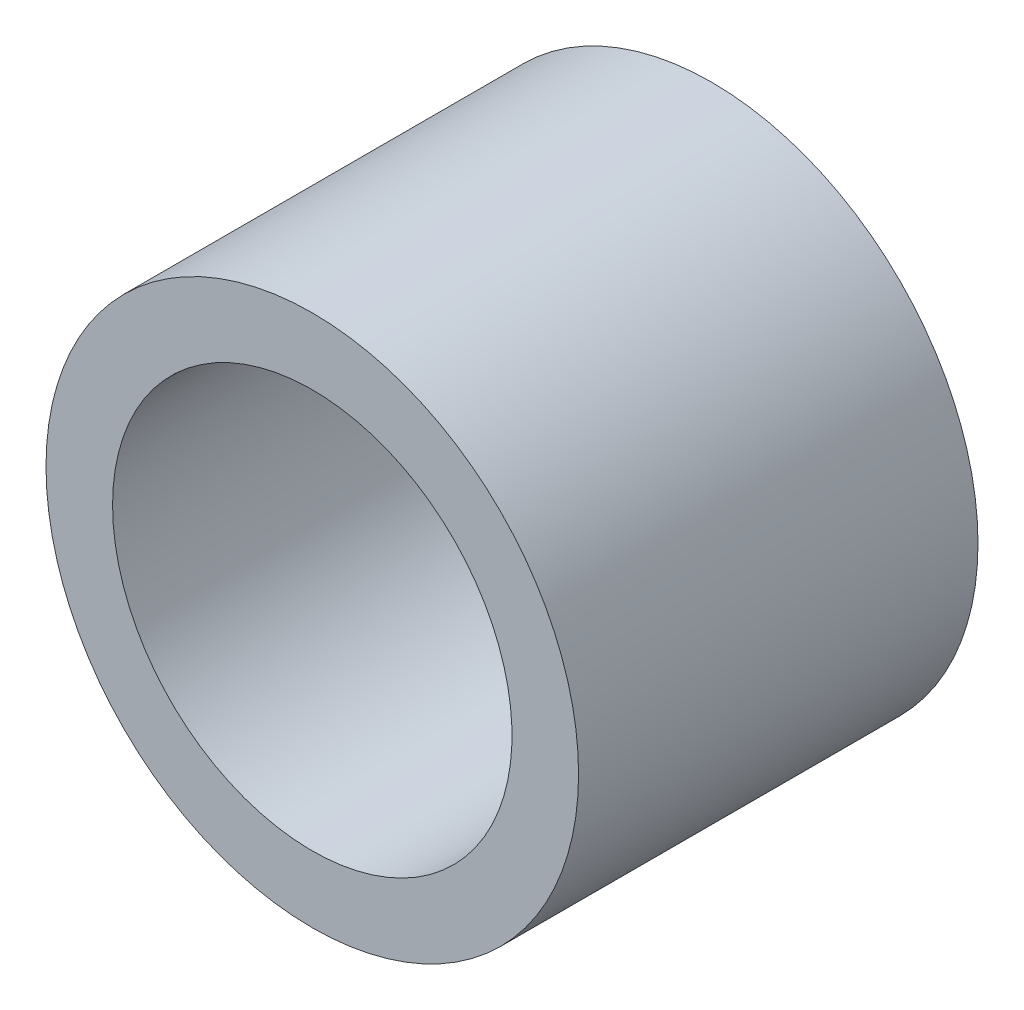
ISO-10303-21;
HEADER;
FILE_DESCRIPTION(('STEP AP214'),'2;1');
FILE_NAME('part.step','',(''),(''),'','','');
FILE_SCHEMA(('AUTOMOTIVE_DESIGN { 1 0 10303 214 1 1 1 1 }'));
ENDSEC;
DATA;
#1=APPLICATION_CONTEXT('core data for automotive mechanical design processes');
#2=APPLICATION_PROTOCOL_DEFINITION('international standard','automotive_design',2000,#1);
#3=PRODUCT_CONTEXT('',#1,'mechanical');
#4=PRODUCT('Part','Part','',(#3));
#5=PRODUCT_RELATED_PRODUCT_CATEGORY('part','',(#4));
#6=PRODUCT_DEFINITION_FORMATION('','',#4);
#7=PRODUCT_DEFINITION_CONTEXT('part definition',#1,'design');
#8=PRODUCT_DEFINITION('design','',#6,#7);
#9=PRODUCT_DEFINITION_SHAPE('','',#8);
#10=(LENGTH_UNIT() NAMED_UNIT(*) SI_UNIT(.MILLI.,.METRE.));
#11=(NAMED_UNIT(*) PLANE_ANGLE_UNIT() SI_UNIT($,.RADIAN.));
#12=(NAMED_UNIT(*) SI_UNIT($,.STERADIAN.) SOLID_ANGLE_UNIT());
#13=UNCERTAINTY_MEASURE_WITH_UNIT(LENGTH_MEASURE(1.E-05),#10,'distance_accuracy_value','');
#14=(GEOMETRIC_REPRESENTATION_CONTEXT(3) GLOBAL_UNCERTAINTY_ASSIGNED_CONTEXT((#13)) GLOBAL_UNIT_ASSIGNED_CONTEXT((#10,
#11,#12)) REPRESENTATION_CONTEXT('',''));
#15=CARTESIAN_POINT('',(0.,0.,0.));
#16=DIRECTION('',(0.,0.,1.));
#17=DIRECTION('',(1.,0.,0.));
#18=AXIS2_PLACEMENT_3D('',#15,#16,#17);
#19=CARTESIAN_POINT('',(0.,0.,9.525));
#20=DIRECTION('',(0.,0.,1.));
#21=DIRECTION('',(1.,0.,0.));
#22=AXIS2_PLACEMENT_3D('',#19,#20,#21);
#23=PLANE('',#22);
#24=CARTESIAN_POINT('',(0.,0.,9.525));
#25=DIRECTION('',(0.,0.,1.));
#26=DIRECTION('',(1.,0.,0.));
#27=AXIS2_PLACEMENT_3D('',#24,#25,#26);
#28=CIRCLE('',#27,12.7);
#29=CARTESIAN_POINT('',(-12.7,0.,9.525));
#30=VERTEX_POINT('',#29);
#31=EDGE_CURVE('E10',#30,#30,#28,.T.);
#32=ORIENTED_EDGE('',*,*,#31,.T.);
#33=EDGE_LOOP('',(#32));
#34=FACE_BOUND('',#33,.T.);
#35=CARTESIAN_POINT('',(0.,0.,9.525));
#36=DIRECTION('',(0.,0.,1.));
#37=DIRECTION('',(1.,0.,0.));
#38=AXIS2_PLACEMENT_3D('',#35,#36,#37);
#39=CIRCLE('',#38,9.525);
#40=CARTESIAN_POINT('',(-9.525,0.,9.525));
#41=VERTEX_POINT('',#40);
#42=EDGE_CURVE('E41',#41,#41,#39,.T.);
#43=ORIENTED_EDGE('',*,*,#42,.F.);
#44=EDGE_LOOP('',(#43));
#45=FACE_BOUND('',#44,.T.);
#46=ADVANCED_FACE('F30',(#34,#45),#23,.T.);
#47=CARTESIAN_POINT('',(0.,0.,-9.525));
#48=DIRECTION('',(0.,0.,1.));
#49=DIRECTION('',(1.,0.,0.));
#50=AXIS2_PLACEMENT_3D('',#47,#48,#49);
#51=PLANE('',#50);
#52=CARTESIAN_POINT('',(0.,0.,-9.525));
#53=DIRECTION('',(0.,0.,1.));
#54=DIRECTION('',(1.,0.,0.));
#55=AXIS2_PLACEMENT_3D('',#52,#53,#54);
#56=CIRCLE('',#55,12.7);
#57=CARTESIAN_POINT('',(-12.7,0.,-9.525));
#58=VERTEX_POINT('',#57);
#59=EDGE_CURVE('E34',#58,#58,#56,.T.);
#60=ORIENTED_EDGE('',*,*,#59,.F.);
#61=EDGE_LOOP('',(#60));
#62=FACE_BOUND('',#61,.T.);
#63=CARTESIAN_POINT('',(0.,0.,-9.525));
#64=DIRECTION('',(0.,0.,1.));
#65=DIRECTION('',(1.,0.,0.));
#66=AXIS2_PLACEMENT_3D('',#63,#64,#65);
#67=CIRCLE('',#66,9.525);
#68=CARTESIAN_POINT('',(-9.525,0.,-9.525));
#69=VERTEX_POINT('',#68);
#70=EDGE_CURVE('E43',#69,#69,#67,.T.);
#71=ORIENTED_EDGE('',*,*,#70,.T.);
#72=EDGE_LOOP('',(#71));
#73=FACE_BOUND('',#72,.T.);
#74=ADVANCED_FACE('F53',(#62,#73),#51,.F.);
#75=CARTESIAN_POINT('',(0.,0.,9.525));
#76=DIRECTION('',(0.,0.,-1.));
#77=DIRECTION('',(-1.,0.,0.));
#78=AXIS2_PLACEMENT_3D('',#75,#76,#77);
#79=CYLINDRICAL_SURFACE('',#78,12.7);
#80=CARTESIAN_POINT('',(-12.7,0.,9.525));
#81=CARTESIAN_POINT('',(-12.7,0.,9.3265625));
#82=CARTESIAN_POINT('',(-12.7,0.,9.128125));
#83=CARTESIAN_POINT('',(-12.7,0.,8.73125));
#84=CARTESIAN_POINT('',(-12.7,0.,8.5328125));
#85=CARTESIAN_POINT('',(-12.7,0.,8.1359375));
#86=CARTESIAN_POINT('',(-12.7,0.,7.9375));
#87=CARTESIAN_POINT('',(-12.7,0.,7.540625));
#88=CARTESIAN_POINT('',(-12.7,0.,7.3421875));
#89=CARTESIAN_POINT('',(-12.7,0.,6.9453125));
#90=CARTESIAN_POINT('',(-12.7,0.,6.746875));
#91=CARTESIAN_POINT('',(-12.7,0.,6.35));
#92=CARTESIAN_POINT('',(-12.7,0.,6.1515625));
#93=CARTESIAN_POINT('',(-12.7,0.,5.7546875));
#94=CARTESIAN_POINT('',(-12.7,0.,5.55625));
#95=CARTESIAN_POINT('',(-12.7,0.,5.159375));
#96=CARTESIAN_POINT('',(-12.7,0.,4.9609375));
#97=CARTESIAN_POINT('',(-12.7,0.,4.5640625));
#98=CARTESIAN_POINT('',(-12.7,0.,4.365625));
#99=CARTESIAN_POINT('',(-12.7,0.,3.96875));
#100=CARTESIAN_POINT('',(-12.7,0.,3.7703125));
#101=CARTESIAN_POINT('',(-12.7,0.,3.3734375));
#102=CARTESIAN_POINT('',(-12.7,0.,3.175));
#103=CARTESIAN_POINT('',(-12.7,0.,2.778125));
#104=CARTESIAN_POINT('',(-12.7,0.,2.5796875));
#105=CARTESIAN_POINT('',(-12.7,0.,2.1828125));
#106=CARTESIAN_POINT('',(-12.7,0.,1.984375));
#107=CARTESIAN_POINT('',(-12.7,0.,1.5875));
#108=CARTESIAN_POINT('',(-12.7,0.,1.3890625));
#109=CARTESIAN_POINT('',(-12.7,0.,0.992187499999999));
#110=CARTESIAN_POINT('',(-12.7,0.,0.793749999999999));
#111=CARTESIAN_POINT('',(-12.7,0.,0.396874999999998));
#112=CARTESIAN_POINT('',(-12.7,0.,0.198437499999998));
#113=CARTESIAN_POINT('',(-12.7,0.,-0.198437500000002));
#114=CARTESIAN_POINT('',(-12.7,0.,-0.396875000000002));
#115=CARTESIAN_POINT('',(-12.7,0.,-0.793750000000002));
#116=CARTESIAN_POINT('',(-12.7,0.,-0.992187500000002));
#117=CARTESIAN_POINT('',(-12.7,0.,-1.3890625));
#118=CARTESIAN_POINT('',(-12.7,0.,-1.5875));
#119=CARTESIAN_POINT('',(-12.7,0.,-1.984375));
#120=CARTESIAN_POINT('',(-12.7,0.,-2.1828125));
#121=CARTESIAN_POINT('',(-12.7,0.,-2.5796875));
#122=CARTESIAN_POINT('',(-12.7,0.,-2.778125));
#123=CARTESIAN_POINT('',(-12.7,0.,-3.175));
#124=CARTESIAN_POINT('',(-12.7,0.,-3.3734375));
#125=CARTESIAN_POINT('',(-12.7,0.,-3.7703125));
#126=CARTESIAN_POINT('',(-12.7,0.,-3.96875));
#127=CARTESIAN_POINT('',(-12.7,0.,-4.365625));
#128=CARTESIAN_POINT('',(-12.7,0.,-4.5640625));
#129=CARTESIAN_POINT('',(-12.7,0.,-4.9609375));
#130=CARTESIAN_POINT('',(-12.7,0.,-5.159375));
#131=CARTESIAN_POINT('',(-12.7,0.,-5.55625));
#132=CARTESIAN_POINT('',(-12.7,0.,-5.7546875));
#133=CARTESIAN_POINT('',(-12.7,0.,-6.1515625));
#134=CARTESIAN_POINT('',(-12.7,0.,-6.35));
#135=CARTESIAN_POINT('',(-12.7,0.,-6.746875));
#136=CARTESIAN_POINT('',(-12.7,0.,-6.9453125));
#137=CARTESIAN_POINT('',(-12.7,0.,-7.3421875));
#138=CARTESIAN_POINT('',(-12.7,0.,-7.540625));
#139=CARTESIAN_POINT('',(-12.7,0.,-7.9375));
#140=CARTESIAN_POINT('',(-12.7,0.,-8.1359375));
#141=CARTESIAN_POINT('',(-12.7,0.,-8.5328125));
#142=CARTESIAN_POINT('',(-12.7,0.,-8.73125));
#143=CARTESIAN_POINT('',(-12.7,0.,-9.128125));
#144=CARTESIAN_POINT('',(-12.7,0.,-9.3265625));
#145=CARTESIAN_POINT('',(-12.7,0.,-9.525));
#146=B_SPLINE_CURVE_WITH_KNOTS('',3,(#80,#81,#82,#83,#84,#85,#86,#87,#88,#89,#90,#91,#92,#93,
#94,#95,#96,#97,#98,#99,#100,#101,#102,#103,#104,#105,#106,#107,#108,#109,#110,#111,#112,#113,
#114,#115,#116,#117,#118,#119,#120,#121,#122,#123,#124,#125,#126,#127,#128,#129,#130,#131,#132,
#133,#134,#135,#136,#137,#138,#139,#140,#141,#142,#143,#144,#145),.UNSPECIFIED.,.F.,.F.,(4,2,2,
2,2,2,2,2,2,2,2,2,2,2,2,2,2,2,2,2,2,2,2,2,2,2,2,2,2,2,2,2,4),(0.,0.595312499999999,1.190625,
1.7859375,2.38125,2.9765625,3.571875,4.1671875,4.7625,5.3578125,5.953125,6.5484375,7.14375,
7.7390625,8.334375,8.9296875,9.525,10.1203125,10.715625,11.3109375,11.90625,12.5015625,
13.096875,13.6921875,14.2875,14.8828125,15.478125,16.0734375,16.66875,17.2640625,17.859375,
18.4546875,19.05),.UNSPECIFIED.);
#147=EDGE_CURVE('BSEAM32',#30,#58,#146,.T.);
#148=ORIENTED_EDGE('',*,*,#31,.F.);
#149=ORIENTED_EDGE('',*,*,#59,.T.);
#150=ORIENTED_EDGE('',*,*,#147,.T.);
#151=ORIENTED_EDGE('',*,*,#147,.F.);
#152=EDGE_LOOP('',(#148,#150,#149,#151));
#153=FACE_BOUND('',#152,.T.);
#154=ADVANCED_FACE('F32',(#153),#79,.T.);
#155=CARTESIAN_POINT('',(0.,0.,9.525));
#156=DIRECTION('',(0.,0.,-1.));
#157=DIRECTION('',(-1.,0.,0.));
#158=AXIS2_PLACEMENT_3D('',#155,#156,#157);
#159=CYLINDRICAL_SURFACE('',#158,9.525);
#160=CARTESIAN_POINT('',(-9.525,0.,9.525));
#161=CARTESIAN_POINT('',(-9.525,0.,9.3265625));
#162=CARTESIAN_POINT('',(-9.525,0.,9.128125));
#163=CARTESIAN_POINT('',(-9.525,0.,8.73125));
#164=CARTESIAN_POINT('',(-9.525,0.,8.5328125));
#165=CARTESIAN_POINT('',(-9.525,0.,8.1359375));
#166=CARTESIAN_POINT('',(-9.525,0.,7.9375));
#167=CARTESIAN_POINT('',(-9.525,0.,7.540625));
#168=CARTESIAN_POINT('',(-9.525,0.,7.3421875));
#169=CARTESIAN_POINT('',(-9.525,0.,6.9453125));
#170=CARTESIAN_POINT('',(-9.525,0.,6.746875));
#171=CARTESIAN_POINT('',(-9.525,0.,6.35));
#172=CARTESIAN_POINT('',(-9.525,0.,6.1515625));
#173=CARTESIAN_POINT('',(-9.525,0.,5.7546875));
#174=CARTESIAN_POINT('',(-9.525,0.,5.55625));
#175=CARTESIAN_POINT('',(-9.525,0.,5.159375));
#176=CARTESIAN_POINT('',(-9.525,0.,4.9609375));
#177=CARTESIAN_POINT('',(-9.525,0.,4.5640625));
#178=CARTESIAN_POINT('',(-9.525,0.,4.365625));
#179=CARTESIAN_POINT('',(-9.525,0.,3.96875));
#180=CARTESIAN_POINT('',(-9.525,0.,3.7703125));
#181=CARTESIAN_POINT('',(-9.525,0.,3.3734375));
#182=CARTESIAN_POINT('',(-9.525,0.,3.175));
#183=CARTESIAN_POINT('',(-9.525,0.,2.778125));
#184=CARTESIAN_POINT('',(-9.525,0.,2.5796875));
#185=CARTESIAN_POINT('',(-9.525,0.,2.1828125));
#186=CARTESIAN_POINT('',(-9.525,0.,1.984375));
#187=CARTESIAN_POINT('',(-9.525,0.,1.5875));
#188=CARTESIAN_POINT('',(-9.525,0.,1.3890625));
#189=CARTESIAN_POINT('',(-9.525,0.,0.992187500000001));
#190=CARTESIAN_POINT('',(-9.525,0.,0.793750000000001));
#191=CARTESIAN_POINT('',(-9.525,0.,0.396875));
#192=CARTESIAN_POINT('',(-9.525,0.,0.1984375));
#193=CARTESIAN_POINT('',(-9.525,0.,-0.1984375));
#194=CARTESIAN_POINT('',(-9.525,0.,-0.396875));
#195=CARTESIAN_POINT('',(-9.525,0.,-0.793750000000001));
#196=CARTESIAN_POINT('',(-9.525,0.,-0.992187500000001));
#197=CARTESIAN_POINT('',(-9.525,0.,-1.3890625));
#198=CARTESIAN_POINT('',(-9.525,0.,-1.5875));
#199=CARTESIAN_POINT('',(-9.525,0.,-1.984375));
#200=CARTESIAN_POINT('',(-9.525,0.,-2.1828125));
#201=CARTESIAN_POINT('',(-9.525,0.,-2.5796875));
#202=CARTESIAN_POINT('',(-9.525,0.,-2.778125));
#203=CARTESIAN_POINT('',(-9.525,0.,-3.175));
#204=CARTESIAN_POINT('',(-9.525,0.,-3.3734375));
#205=CARTESIAN_POINT('',(-9.525,0.,-3.7703125));
#206=CARTESIAN_POINT('',(-9.525,0.,-3.96875));
#207=CARTESIAN_POINT('',(-9.525,0.,-4.365625));
#208=CARTESIAN_POINT('',(-9.525,0.,-4.5640625));
#209=CARTESIAN_POINT('',(-9.525,0.,-4.9609375));
#210=CARTESIAN_POINT('',(-9.525,0.,-5.159375));
#211=CARTESIAN_POINT('',(-9.525,0.,-5.55625));
#212=CARTESIAN_POINT('',(-9.525,0.,-5.7546875));
#213=CARTESIAN_POINT('',(-9.525,0.,-6.1515625));
#214=CARTESIAN_POINT('',(-9.525,0.,-6.35));
#215=CARTESIAN_POINT('',(-9.525,0.,-6.746875));
#216=CARTESIAN_POINT('',(-9.525,0.,-6.9453125));
#217=CARTESIAN_POINT('',(-9.525,0.,-7.3421875));
#218=CARTESIAN_POINT('',(-9.525,0.,-7.540625));
#219=CARTESIAN_POINT('',(-9.525,0.,-7.9375));
#220=CARTESIAN_POINT('',(-9.525,0.,-8.1359375));
#221=CARTESIAN_POINT('',(-9.525,0.,-8.5328125));
#222=CARTESIAN_POINT('',(-9.525,0.,-8.73125));
#223=CARTESIAN_POINT('',(-9.525,0.,-9.128125));
#224=CARTESIAN_POINT('',(-9.525,0.,-9.3265625));
#225=CARTESIAN_POINT('',(-9.525,0.,-9.525));
#226=B_SPLINE_CURVE_WITH_KNOTS('',3,(#160,#161,#162,#163,#164,#165,#166,#167,#168,#169,#170,
#171,#172,#173,#174,#175,#176,#177,#178,#179,#180,#181,#182,#183,#184,#185,#186,#187,#188,#189,
#190,#191,#192,#193,#194,#195,#196,#197,#198,#199,#200,#201,#202,#203,#204,#205,#206,#207,#208,
#209,#210,#211,#212,#213,#214,#215,#216,#217,#218,#219,#220,#221,#222,#223,#224,#225),
.UNSPECIFIED.,.F.,.F.,(4,2,2,2,2,2,2,2,2,2,2,2,2,2,2,2,2,2,2,2,2,2,2,2,2,2,2,2,2,2,2,2,4),(0.,
0.5953125,1.190625,1.7859375,2.38125,2.9765625,3.571875,4.1671875,4.7625,5.3578125,5.953125,
6.5484375,7.14375,7.7390625,8.334375,8.9296875,9.525,10.1203125,10.715625,11.3109375,11.90625,
12.5015625,13.096875,13.6921875,14.2875,14.8828125,15.478125,16.0734375,16.66875,17.2640625,
17.859375,18.4546875,19.05),.UNSPECIFIED.);
#227=EDGE_CURVE('BSEAM49',#41,#69,#226,.T.);
#228=ORIENTED_EDGE('',*,*,#42,.T.);
#229=ORIENTED_EDGE('',*,*,#70,.F.);
#230=ORIENTED_EDGE('',*,*,#227,.T.);
#231=ORIENTED_EDGE('',*,*,#227,.F.);
#232=EDGE_LOOP('',(#228,#230,#229,#231));
#233=FACE_BOUND('',#232,.T.);
#234=ADVANCED_FACE('F49',(#233),#159,.F.);
#235=CLOSED_SHELL('',(#46,#74,#154,#234));
#236=MANIFOLD_SOLID_BREP('B2',#235);
#237=ADVANCED_BREP_SHAPE_REPRESENTATION('',(#18,#236),#14);
#238=SHAPE_DEFINITION_REPRESENTATION(#9,#237);
ENDSEC;
END-ISO-10303-21;
